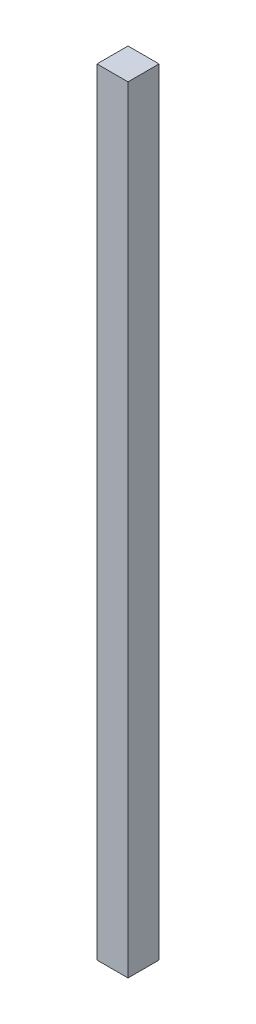
ISO-10303-21;
HEADER;
FILE_DESCRIPTION(('STEP AP214'),'2;1');
FILE_NAME('part.step','',(''),(''),'','','');
FILE_SCHEMA(('AUTOMOTIVE_DESIGN { 1 0 10303 214 1 1 1 1 }'));
ENDSEC;
DATA;
#1=APPLICATION_CONTEXT('core data for automotive mechanical design processes');
#2=APPLICATION_PROTOCOL_DEFINITION('international standard','automotive_design',2000,#1);
#3=PRODUCT_CONTEXT('',#1,'mechanical');
#4=PRODUCT('Part','Part','',(#3));
#5=PRODUCT_RELATED_PRODUCT_CATEGORY('part','',(#4));
#6=PRODUCT_DEFINITION_FORMATION('','',#4);
#7=PRODUCT_DEFINITION_CONTEXT('part definition',#1,'design');
#8=PRODUCT_DEFINITION('design','',#6,#7);
#9=PRODUCT_DEFINITION_SHAPE('','',#8);
#10=(LENGTH_UNIT() NAMED_UNIT(*) SI_UNIT(.MILLI.,.METRE.));
#11=(NAMED_UNIT(*) PLANE_ANGLE_UNIT() SI_UNIT($,.RADIAN.));
#12=(NAMED_UNIT(*) SI_UNIT($,.STERADIAN.) SOLID_ANGLE_UNIT());
#13=UNCERTAINTY_MEASURE_WITH_UNIT(LENGTH_MEASURE(1.E-05),#10,'distance_accuracy_value','');
#14=(GEOMETRIC_REPRESENTATION_CONTEXT(3) GLOBAL_UNCERTAINTY_ASSIGNED_CONTEXT((#13)) GLOBAL_UNIT_ASSIGNED_CONTEXT((#10,
#11,#12)) REPRESENTATION_CONTEXT('',''));
#15=CARTESIAN_POINT('',(0.,0.,0.));
#16=DIRECTION('',(0.,0.,1.));
#17=DIRECTION('',(1.,0.,0.));
#18=AXIS2_PLACEMENT_3D('',#15,#16,#17);
#19=CARTESIAN_POINT('',(0.,0.,40.));
#20=DIRECTION('',(1.,0.,0.));
#21=DIRECTION('',(0.,0.,-1.));
#22=AXIS2_PLACEMENT_3D('',#19,#20,#21);
#23=PLANE('',#22);
#24=DIRECTION('',(0.,-1.,0.));
#25=VECTOR('',#24,1.);
#26=CARTESIAN_POINT('',(0.,0.,0.));
#27=LINE('',#26,#25);
#28=CARTESIAN_POINT('',(0.,1000.,0.));
#29=VERTEX_POINT('',#28);
#30=CARTESIAN_POINT('',(0.,0.,0.));
#31=VERTEX_POINT('',#30);
#32=EDGE_CURVE('E107',#29,#31,#27,.T.);
#33=ORIENTED_EDGE('',*,*,#32,.T.);
#34=DIRECTION('',(0.,0.,-1.));
#35=VECTOR('',#34,1.);
#36=CARTESIAN_POINT('',(0.,0.,40.));
#37=LINE('',#36,#35);
#38=CARTESIAN_POINT('',(0.,0.,40.));
#39=VERTEX_POINT('',#38);
#40=EDGE_CURVE('E11',#39,#31,#37,.T.);
#41=ORIENTED_EDGE('',*,*,#40,.F.);
#42=DIRECTION('',(0.,-1.,0.));
#43=VECTOR('',#42,1.);
#44=CARTESIAN_POINT('',(0.,0.,40.));
#45=LINE('',#44,#43);
#46=CARTESIAN_POINT('',(0.,1000.,40.));
#47=VERTEX_POINT('',#46);
#48=EDGE_CURVE('E91',#47,#39,#45,.T.);
#49=ORIENTED_EDGE('',*,*,#48,.F.);
#50=DIRECTION('',(0.,0.,-1.));
#51=VECTOR('',#50,1.);
#52=CARTESIAN_POINT('',(0.,1000.,40.));
#53=LINE('',#52,#51);
#54=EDGE_CURVE('E103',#47,#29,#53,.T.);
#55=ORIENTED_EDGE('',*,*,#54,.T.);
#56=EDGE_LOOP('',(#33,#41,#49,#55));
#57=FACE_BOUND('',#56,.T.);
#58=ADVANCED_FACE('F39',(#57),#23,.F.);
#59=CARTESIAN_POINT('',(0.,0.,40.));
#60=DIRECTION('',(0.,1.,0.));
#61=DIRECTION('',(0.,0.,1.));
#62=AXIS2_PLACEMENT_3D('',#59,#60,#61);
#63=PLANE('',#62);
#64=DIRECTION('',(1.,0.,0.));
#65=VECTOR('',#64,1.);
#66=CARTESIAN_POINT('',(0.,0.,0.));
#67=LINE('',#66,#65);
#68=CARTESIAN_POINT('',(40.,0.,0.));
#69=VERTEX_POINT('',#68);
#70=EDGE_CURVE('E96',#31,#69,#67,.T.);
#71=ORIENTED_EDGE('',*,*,#70,.T.);
#72=DIRECTION('',(0.,0.,-1.));
#73=VECTOR('',#72,1.);
#74=CARTESIAN_POINT('',(40.,0.,40.));
#75=LINE('',#74,#73);
#76=CARTESIAN_POINT('',(40.,0.,40.));
#77=VERTEX_POINT('',#76);
#78=EDGE_CURVE('E48',#77,#69,#75,.T.);
#79=ORIENTED_EDGE('',*,*,#78,.F.);
#80=DIRECTION('',(1.,0.,0.));
#81=VECTOR('',#80,1.);
#82=CARTESIAN_POINT('',(0.,0.,40.));
#83=LINE('',#82,#81);
#84=EDGE_CURVE('E86',#39,#77,#83,.T.);
#85=ORIENTED_EDGE('',*,*,#84,.F.);
#86=ORIENTED_EDGE('',*,*,#40,.T.);
#87=EDGE_LOOP('',(#71,#79,#85,#86));
#88=FACE_BOUND('',#87,.T.);
#89=ADVANCED_FACE('F95',(#88),#63,.F.);
#90=CARTESIAN_POINT('',(40.,0.,40.));
#91=DIRECTION('',(-1.,0.,0.));
#92=DIRECTION('',(0.,0.,1.));
#93=AXIS2_PLACEMENT_3D('',#90,#91,#92);
#94=PLANE('',#93);
#95=DIRECTION('',(0.,1.,0.));
#96=VECTOR('',#95,1.);
#97=CARTESIAN_POINT('',(40.,0.,0.));
#98=LINE('',#97,#96);
#99=CARTESIAN_POINT('',(40.,1000.,0.));
#100=VERTEX_POINT('',#99);
#101=EDGE_CURVE('E73',#69,#100,#98,.T.);
#102=ORIENTED_EDGE('',*,*,#101,.T.);
#103=DIRECTION('',(0.,0.,-1.));
#104=VECTOR('',#103,1.);
#105=CARTESIAN_POINT('',(40.,1000.,40.));
#106=LINE('',#105,#104);
#107=CARTESIAN_POINT('',(40.,1000.,40.));
#108=VERTEX_POINT('',#107);
#109=EDGE_CURVE('E98',#108,#100,#106,.T.);
#110=ORIENTED_EDGE('',*,*,#109,.F.);
#111=DIRECTION('',(0.,1.,0.));
#112=VECTOR('',#111,1.);
#113=CARTESIAN_POINT('',(40.,0.,40.));
#114=LINE('',#113,#112);
#115=EDGE_CURVE('E89',#77,#108,#114,.T.);
#116=ORIENTED_EDGE('',*,*,#115,.F.);
#117=ORIENTED_EDGE('',*,*,#78,.T.);
#118=EDGE_LOOP('',(#102,#110,#116,#117));
#119=FACE_BOUND('',#118,.T.);
#120=ADVANCED_FACE('F99',(#119),#94,.F.);
#121=CARTESIAN_POINT('',(0.,1000.,40.));
#122=DIRECTION('',(0.,-1.,0.));
#123=DIRECTION('',(0.,0.,-1.));
#124=AXIS2_PLACEMENT_3D('',#121,#122,#123);
#125=PLANE('',#124);
#126=DIRECTION('',(-1.,0.,0.));
#127=VECTOR('',#126,1.);
#128=CARTESIAN_POINT('',(0.,1000.,0.));
#129=LINE('',#128,#127);
#130=EDGE_CURVE('E79',#100,#29,#129,.T.);
#131=ORIENTED_EDGE('',*,*,#130,.T.);
#132=ORIENTED_EDGE('',*,*,#54,.F.);
#133=DIRECTION('',(-1.,0.,0.));
#134=VECTOR('',#133,1.);
#135=CARTESIAN_POINT('',(0.,1000.,40.));
#136=LINE('',#135,#134);
#137=EDGE_CURVE('E56',#108,#47,#136,.T.);
#138=ORIENTED_EDGE('',*,*,#137,.F.);
#139=ORIENTED_EDGE('',*,*,#109,.T.);
#140=EDGE_LOOP('',(#131,#132,#138,#139));
#141=FACE_BOUND('',#140,.T.);
#142=ADVANCED_FACE('F120',(#141),#125,.F.);
#143=CARTESIAN_POINT('',(0.,0.,40.));
#144=DIRECTION('',(0.,0.,-1.));
#145=DIRECTION('',(-1.,0.,0.));
#146=AXIS2_PLACEMENT_3D('',#143,#144,#145);
#147=PLANE('',#146);
#148=ORIENTED_EDGE('',*,*,#48,.T.);
#149=ORIENTED_EDGE('',*,*,#84,.T.);
#150=ORIENTED_EDGE('',*,*,#115,.T.);
#151=ORIENTED_EDGE('',*,*,#137,.T.);
#152=EDGE_LOOP('',(#148,#149,#150,#151));
#153=FACE_BOUND('',#152,.T.);
#154=ADVANCED_FACE('F87',(#153),#147,.F.);
#155=CARTESIAN_POINT('',(0.,0.,0.));
#156=DIRECTION('',(0.,0.,-1.));
#157=DIRECTION('',(-1.,0.,0.));
#158=AXIS2_PLACEMENT_3D('',#155,#156,#157);
#159=PLANE('',#158);
#160=ORIENTED_EDGE('',*,*,#32,.F.);
#161=ORIENTED_EDGE('',*,*,#130,.F.);
#162=ORIENTED_EDGE('',*,*,#101,.F.);
#163=ORIENTED_EDGE('',*,*,#70,.F.);
#164=EDGE_LOOP('',(#160,#161,#162,#163));
#165=FACE_BOUND('',#164,.T.);
#166=ADVANCED_FACE('F123',(#165),#159,.T.);
#167=CLOSED_SHELL('',(#58,#89,#120,#142,#154,#166));
#168=MANIFOLD_SOLID_BREP('B2',#167);
#169=ADVANCED_BREP_SHAPE_REPRESENTATION('',(#18,#168),#14);
#170=SHAPE_DEFINITION_REPRESENTATION(#9,#169);
ENDSEC;
END-ISO-10303-21;
